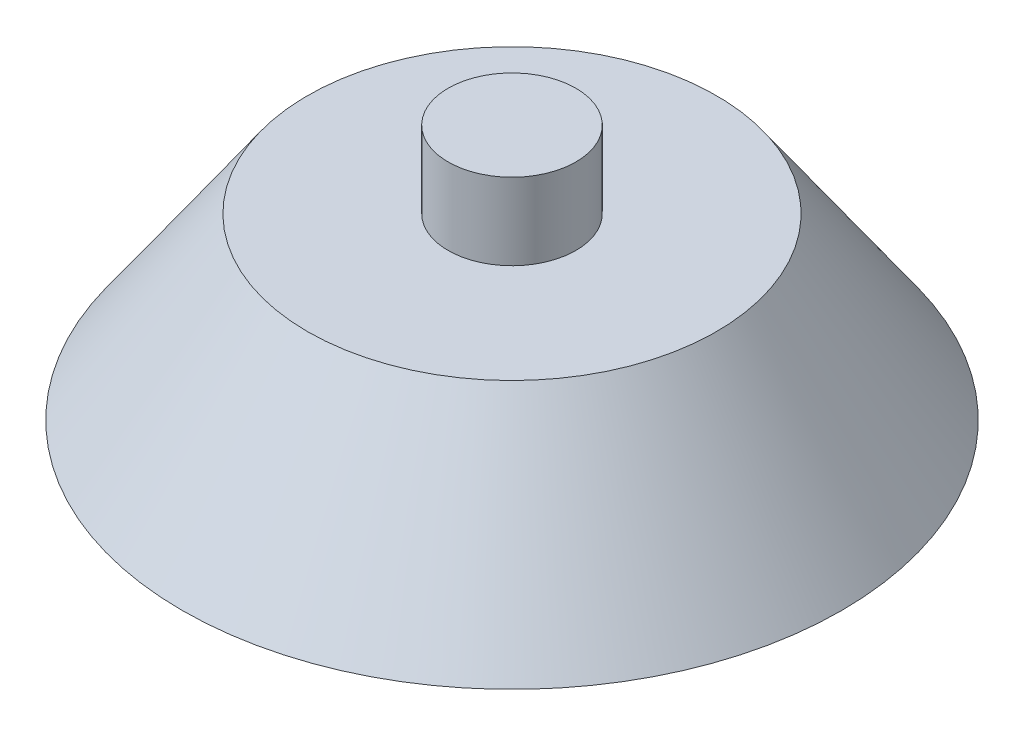
ISO-10303-21;
HEADER;
FILE_DESCRIPTION(('STEP AP214'),'2;1');
FILE_NAME('part.step','',(''),(''),'','','');
FILE_SCHEMA(('AUTOMOTIVE_DESIGN { 1 0 10303 214 1 1 1 1 }'));
ENDSEC;
DATA;
#1=APPLICATION_CONTEXT('core data for automotive mechanical design processes');
#2=APPLICATION_PROTOCOL_DEFINITION('international standard','automotive_design',2000,#1);
#3=PRODUCT_CONTEXT('',#1,'mechanical');
#4=PRODUCT('Part','Part','',(#3));
#5=PRODUCT_RELATED_PRODUCT_CATEGORY('part','',(#4));
#6=PRODUCT_DEFINITION_FORMATION('','',#4);
#7=PRODUCT_DEFINITION_CONTEXT('part definition',#1,'design');
#8=PRODUCT_DEFINITION('design','',#6,#7);
#9=PRODUCT_DEFINITION_SHAPE('','',#8);
#10=(LENGTH_UNIT() NAMED_UNIT(*) SI_UNIT(.MILLI.,.METRE.));
#11=(NAMED_UNIT(*) PLANE_ANGLE_UNIT() SI_UNIT($,.RADIAN.));
#12=(NAMED_UNIT(*) SI_UNIT($,.STERADIAN.) SOLID_ANGLE_UNIT());
#13=UNCERTAINTY_MEASURE_WITH_UNIT(LENGTH_MEASURE(1.E-05),#10,'distance_accuracy_value','');
#14=(GEOMETRIC_REPRESENTATION_CONTEXT(3) GLOBAL_UNCERTAINTY_ASSIGNED_CONTEXT((#13)) GLOBAL_UNIT_ASSIGNED_CONTEXT((#10,
#11,#12)) REPRESENTATION_CONTEXT('',''));
#15=CARTESIAN_POINT('',(0.,0.,0.));
#16=DIRECTION('',(0.,0.,1.));
#17=DIRECTION('',(1.,0.,0.));
#18=AXIS2_PLACEMENT_3D('',#15,#16,#17);
#19=CARTESIAN_POINT('',(0.,100.,0.));
#20=DIRECTION('',(0.,-1.,0.));
#21=DIRECTION('',(0.,0.,-1.));
#22=AXIS2_PLACEMENT_3D('',#19,#20,#21);
#23=CYLINDRICAL_SURFACE('',#22,25.);
#24=CARTESIAN_POINT('',(0.,70.,0.));
#25=DIRECTION('',(0.,1.,0.));
#26=DIRECTION('',(0.,0.,1.));
#27=AXIS2_PLACEMENT_3D('',#24,#25,#26);
#28=CIRCLE('',#27,25.);
#29=CARTESIAN_POINT('',(0.,70.,-25.));
#30=VERTEX_POINT('',#29);
#31=EDGE_CURVE('E53',#30,#30,#28,.T.);
#32=CARTESIAN_POINT('',(0.,100.,0.));
#33=DIRECTION('',(0.,1.,0.));
#34=DIRECTION('',(0.,0.,1.));
#35=AXIS2_PLACEMENT_3D('',#32,#33,#34);
#36=CIRCLE('',#35,25.);
#37=CARTESIAN_POINT('',(0.,100.,-25.));
#38=VERTEX_POINT('',#37);
#39=EDGE_CURVE('E11',#38,#38,#36,.T.);
#40=CARTESIAN_POINT('',(0.,70.,-25.));
#41=CARTESIAN_POINT('',(0.,70.3125,-25.));
#42=CARTESIAN_POINT('',(0.,70.625,-25.));
#43=CARTESIAN_POINT('',(0.,71.25,-25.));
#44=CARTESIAN_POINT('',(0.,71.5625,-25.));
#45=CARTESIAN_POINT('',(0.,72.1875,-25.));
#46=CARTESIAN_POINT('',(0.,72.5,-25.));
#47=CARTESIAN_POINT('',(0.,73.125,-25.));
#48=CARTESIAN_POINT('',(0.,73.4375,-25.));
#49=CARTESIAN_POINT('',(0.,74.0625,-25.));
#50=CARTESIAN_POINT('',(0.,74.375,-25.));
#51=CARTESIAN_POINT('',(0.,75.,-25.));
#52=CARTESIAN_POINT('',(0.,75.3125,-25.));
#53=CARTESIAN_POINT('',(0.,75.9375,-25.));
#54=CARTESIAN_POINT('',(0.,76.25,-25.));
#55=CARTESIAN_POINT('',(0.,76.875,-25.));
#56=CARTESIAN_POINT('',(0.,77.1875,-25.));
#57=CARTESIAN_POINT('',(0.,77.8125,-25.));
#58=CARTESIAN_POINT('',(0.,78.125,-25.));
#59=CARTESIAN_POINT('',(0.,78.75,-25.));
#60=CARTESIAN_POINT('',(0.,79.0625,-25.));
#61=CARTESIAN_POINT('',(0.,79.6875,-25.));
#62=CARTESIAN_POINT('',(0.,80.,-25.));
#63=CARTESIAN_POINT('',(0.,80.625,-25.));
#64=CARTESIAN_POINT('',(0.,80.9375,-25.));
#65=CARTESIAN_POINT('',(0.,81.5625,-25.));
#66=CARTESIAN_POINT('',(0.,81.875,-25.));
#67=CARTESIAN_POINT('',(0.,82.5,-25.));
#68=CARTESIAN_POINT('',(0.,82.8125,-25.));
#69=CARTESIAN_POINT('',(0.,83.4375,-25.));
#70=CARTESIAN_POINT('',(0.,83.75,-25.));
#71=CARTESIAN_POINT('',(0.,84.375,-25.));
#72=CARTESIAN_POINT('',(0.,84.6875,-25.));
#73=CARTESIAN_POINT('',(0.,85.3125,-25.));
#74=CARTESIAN_POINT('',(0.,85.625,-25.));
#75=CARTESIAN_POINT('',(0.,86.25,-25.));
#76=CARTESIAN_POINT('',(0.,86.5625,-25.));
#77=CARTESIAN_POINT('',(0.,87.1875,-25.));
#78=CARTESIAN_POINT('',(0.,87.5,-25.));
#79=CARTESIAN_POINT('',(0.,88.125,-25.));
#80=CARTESIAN_POINT('',(0.,88.4375,-25.));
#81=CARTESIAN_POINT('',(0.,89.0625,-25.));
#82=CARTESIAN_POINT('',(0.,89.375,-25.));
#83=CARTESIAN_POINT('',(0.,90.,-25.));
#84=CARTESIAN_POINT('',(0.,90.3125,-25.));
#85=CARTESIAN_POINT('',(0.,90.9375,-25.));
#86=CARTESIAN_POINT('',(0.,91.25,-25.));
#87=CARTESIAN_POINT('',(0.,91.875,-25.));
#88=CARTESIAN_POINT('',(0.,92.1875,-25.));
#89=CARTESIAN_POINT('',(0.,92.8125,-25.));
#90=CARTESIAN_POINT('',(0.,93.125,-25.));
#91=CARTESIAN_POINT('',(0.,93.75,-25.));
#92=CARTESIAN_POINT('',(0.,94.0625,-25.));
#93=CARTESIAN_POINT('',(0.,94.6875,-25.));
#94=CARTESIAN_POINT('',(0.,95.,-25.));
#95=CARTESIAN_POINT('',(0.,95.625,-25.));
#96=CARTESIAN_POINT('',(0.,95.9375,-25.));
#97=CARTESIAN_POINT('',(0.,96.5625,-25.));
#98=CARTESIAN_POINT('',(0.,96.875,-25.));
#99=CARTESIAN_POINT('',(0.,97.5,-25.));
#100=CARTESIAN_POINT('',(0.,97.8125,-25.));
#101=CARTESIAN_POINT('',(0.,98.4375,-25.));
#102=CARTESIAN_POINT('',(0.,98.75,-25.));
#103=CARTESIAN_POINT('',(0.,99.375,-25.));
#104=CARTESIAN_POINT('',(0.,99.6875,-25.));
#105=CARTESIAN_POINT('',(0.,100.,-25.));
#106=B_SPLINE_CURVE_WITH_KNOTS('',3,(#40,#41,#42,#43,#44,#45,#46,#47,#48,#49,#50,#51,#52,#53,
#54,#55,#56,#57,#58,#59,#60,#61,#62,#63,#64,#65,#66,#67,#68,#69,#70,#71,#72,#73,#74,#75,#76,#77,
#78,#79,#80,#81,#82,#83,#84,#85,#86,#87,#88,#89,#90,#91,#92,#93,#94,#95,#96,#97,#98,#99,#100,
#101,#102,#103,#104,#105),.UNSPECIFIED.,.F.,.F.,(4,2,2,2,2,2,2,2,2,2,2,2,2,2,2,2,2,2,2,2,2,2,2,
2,2,2,2,2,2,2,2,2,4),(0.,0.937500000000008,1.875,2.81250000000001,3.75,4.6875,5.62500000000001,
6.5625,7.50000000000001,8.4375,9.37500000000001,10.3125,11.25,12.1875,13.125,14.0625,15.,
15.9375,16.875,17.8125,18.75,19.6875,20.625,21.5625,22.5,23.4375,24.375,25.3125,26.25,27.1875,
28.125,29.0625,30.),.UNSPECIFIED.);
#107=EDGE_CURVE('BSEAM43',#30,#38,#106,.T.);
#108=ORIENTED_EDGE('',*,*,#31,.T.);
#109=ORIENTED_EDGE('',*,*,#39,.F.);
#110=ORIENTED_EDGE('',*,*,#107,.T.);
#111=ORIENTED_EDGE('',*,*,#107,.F.);
#112=EDGE_LOOP('',(#108,#110,#109,#111));
#113=FACE_BOUND('',#112,.T.);
#114=ADVANCED_FACE('F43',(#113),#23,.T.);
#115=CARTESIAN_POINT('',(0.,100.,0.));
#116=DIRECTION('',(0.,1.,0.));
#117=DIRECTION('',(0.,0.,1.));
#118=AXIS2_PLACEMENT_3D('',#115,#116,#117);
#119=PLANE('',#118);
#120=ORIENTED_EDGE('',*,*,#39,.T.);
#121=EDGE_LOOP('',(#120));
#122=FACE_BOUND('',#121,.T.);
#123=ADVANCED_FACE('F154',(#122),#119,.T.);
#124=CARTESIAN_POINT('',(0.,70.,0.));
#125=DIRECTION('',(0.,-1.,0.));
#126=DIRECTION('',(0.,0.,1.));
#127=AXIS2_PLACEMENT_3D('',#124,#125,#126);
#128=CONICAL_SURFACE('',#127,80.,0.610865238198017);
#129=CARTESIAN_POINT('',(0.,70.,0.));
#130=DIRECTION('',(0.,1.,0.));
#131=DIRECTION('',(0.,0.,1.));
#132=AXIS2_PLACEMENT_3D('',#129,#130,#131);
#133=CIRCLE('',#132,80.);
#134=CARTESIAN_POINT('',(0.,70.,80.));
#135=VERTEX_POINT('',#134);
#136=EDGE_CURVE('E136',#135,#135,#133,.T.);
#137=ORIENTED_EDGE('',*,*,#136,.F.);
#138=EDGE_LOOP('',(#137));
#139=FACE_BOUND('',#138,.T.);
#140=CARTESIAN_POINT('',(0.,0.,0.));
#141=DIRECTION('',(0.,1.,0.));
#142=DIRECTION('',(0.,0.,1.));
#143=AXIS2_PLACEMENT_3D('',#140,#141,#142);
#144=CIRCLE('',#143,129.01452767468);
#145=CARTESIAN_POINT('',(0.,0.,129.01452767468));
#146=VERTEX_POINT('',#145);
#147=EDGE_CURVE('E47',#146,#146,#144,.T.);
#148=ORIENTED_EDGE('',*,*,#147,.T.);
#149=EDGE_LOOP('',(#148));
#150=FACE_BOUND('',#149,.T.);
#151=ADVANCED_FACE('F45',(#139,#150),#128,.T.);
#152=CARTESIAN_POINT('',(0.,70.,0.));
#153=DIRECTION('',(0.,1.,0.));
#154=DIRECTION('',(0.,0.,1.));
#155=AXIS2_PLACEMENT_3D('',#152,#153,#154);
#156=PLANE('',#155);
#157=ORIENTED_EDGE('',*,*,#31,.F.);
#158=EDGE_LOOP('',(#157));
#159=FACE_BOUND('',#158,.T.);
#160=ORIENTED_EDGE('',*,*,#136,.T.);
#161=EDGE_LOOP('',(#160));
#162=FACE_BOUND('',#161,.T.);
#163=ADVANCED_FACE('F145',(#159,#162),#156,.T.);
#164=CARTESIAN_POINT('',(0.,0.,0.));
#165=DIRECTION('',(0.,1.,0.));
#166=DIRECTION('',(0.,0.,1.));
#167=AXIS2_PLACEMENT_3D('',#164,#165,#166);
#168=PLANE('',#167);
#169=DIRECTION('',(1.,0.,0.));
#170=VECTOR('',#169,1.);
#171=CARTESIAN_POINT('',(25.,0.,-25.));
#172=LINE('',#171,#170);
#173=CARTESIAN_POINT('',(-25.,0.,-25.));
#174=VERTEX_POINT('',#173);
#175=CARTESIAN_POINT('',(25.,0.,-25.));
#176=VERTEX_POINT('',#175);
#177=EDGE_CURVE('E96',#174,#176,#172,.T.);
#178=ORIENTED_EDGE('',*,*,#177,.F.);
#179=DIRECTION('',(0.,0.,-1.));
#180=VECTOR('',#179,1.);
#181=CARTESIAN_POINT('',(-25.,0.,25.));
#182=LINE('',#181,#180);
#183=CARTESIAN_POINT('',(-25.,0.,25.));
#184=VERTEX_POINT('',#183);
#185=EDGE_CURVE('E61',#184,#174,#182,.T.);
#186=ORIENTED_EDGE('',*,*,#185,.F.);
#187=DIRECTION('',(-1.,0.,0.));
#188=VECTOR('',#187,1.);
#189=CARTESIAN_POINT('',(25.,0.,25.));
#190=LINE('',#189,#188);
#191=CARTESIAN_POINT('',(25.,0.,25.));
#192=VERTEX_POINT('',#191);
#193=EDGE_CURVE('E116',#192,#184,#190,.T.);
#194=ORIENTED_EDGE('',*,*,#193,.F.);
#195=DIRECTION('',(0.,0.,1.));
#196=VECTOR('',#195,1.);
#197=CARTESIAN_POINT('',(25.,0.,25.));
#198=LINE('',#197,#196);
#199=EDGE_CURVE('E125',#176,#192,#198,.T.);
#200=ORIENTED_EDGE('',*,*,#199,.F.);
#201=EDGE_LOOP('',(#178,#186,#194,#200));
#202=FACE_BOUND('',#201,.T.);
#203=ORIENTED_EDGE('',*,*,#147,.F.);
#204=EDGE_LOOP('',(#203));
#205=FACE_BOUND('',#204,.T.);
#206=ADVANCED_FACE('F148',(#202,#205),#168,.F.);
#207=CARTESIAN_POINT('',(-25.,50.,25.));
#208=DIRECTION('',(-1.,0.,0.));
#209=DIRECTION('',(0.,0.,1.));
#210=AXIS2_PLACEMENT_3D('',#207,#208,#209);
#211=PLANE('',#210);
#212=ORIENTED_EDGE('',*,*,#185,.T.);
#213=DIRECTION('',(0.,-1.,0.));
#214=VECTOR('',#213,1.);
#215=CARTESIAN_POINT('',(-25.,50.,-25.));
#216=LINE('',#215,#214);
#217=CARTESIAN_POINT('',(-25.,50.,-25.));
#218=VERTEX_POINT('',#217);
#219=EDGE_CURVE('E84',#218,#174,#216,.T.);
#220=ORIENTED_EDGE('',*,*,#219,.F.);
#221=DIRECTION('',(0.,0.,-1.));
#222=VECTOR('',#221,1.);
#223=CARTESIAN_POINT('',(-25.,50.,25.));
#224=LINE('',#223,#222);
#225=CARTESIAN_POINT('',(-25.,50.,25.));
#226=VERTEX_POINT('',#225);
#227=EDGE_CURVE('E112',#226,#218,#224,.T.);
#228=ORIENTED_EDGE('',*,*,#227,.F.);
#229=DIRECTION('',(0.,-1.,0.));
#230=VECTOR('',#229,1.);
#231=CARTESIAN_POINT('',(-25.,50.,25.));
#232=LINE('',#231,#230);
#233=EDGE_CURVE('E69',#226,#184,#232,.T.);
#234=ORIENTED_EDGE('',*,*,#233,.T.);
#235=EDGE_LOOP('',(#212,#220,#228,#234));
#236=FACE_BOUND('',#235,.T.);
#237=ADVANCED_FACE('F160',(#236),#211,.F.);
#238=CARTESIAN_POINT('',(25.,50.,25.));
#239=DIRECTION('',(0.,0.,1.));
#240=DIRECTION('',(1.,0.,0.));
#241=AXIS2_PLACEMENT_3D('',#238,#239,#240);
#242=PLANE('',#241);
#243=ORIENTED_EDGE('',*,*,#193,.T.);
#244=ORIENTED_EDGE('',*,*,#233,.F.);
#245=DIRECTION('',(-1.,0.,0.));
#246=VECTOR('',#245,1.);
#247=CARTESIAN_POINT('',(25.,50.,25.));
#248=LINE('',#247,#246);
#249=CARTESIAN_POINT('',(25.,50.,25.));
#250=VERTEX_POINT('',#249);
#251=EDGE_CURVE('E109',#250,#226,#248,.T.);
#252=ORIENTED_EDGE('',*,*,#251,.F.);
#253=DIRECTION('',(0.,-1.,0.));
#254=VECTOR('',#253,1.);
#255=CARTESIAN_POINT('',(25.,50.,25.));
#256=LINE('',#255,#254);
#257=EDGE_CURVE('E101',#250,#192,#256,.T.);
#258=ORIENTED_EDGE('',*,*,#257,.T.);
#259=EDGE_LOOP('',(#243,#244,#252,#258));
#260=FACE_BOUND('',#259,.T.);
#261=ADVANCED_FACE('F166',(#260),#242,.F.);
#262=CARTESIAN_POINT('',(25.,50.,25.));
#263=DIRECTION('',(1.,0.,0.));
#264=DIRECTION('',(0.,0.,-1.));
#265=AXIS2_PLACEMENT_3D('',#262,#263,#264);
#266=PLANE('',#265);
#267=ORIENTED_EDGE('',*,*,#199,.T.);
#268=ORIENTED_EDGE('',*,*,#257,.F.);
#269=DIRECTION('',(0.,0.,1.));
#270=VECTOR('',#269,1.);
#271=CARTESIAN_POINT('',(25.,50.,25.));
#272=LINE('',#271,#270);
#273=CARTESIAN_POINT('',(25.,50.,-25.));
#274=VERTEX_POINT('',#273);
#275=EDGE_CURVE('E104',#274,#250,#272,.T.);
#276=ORIENTED_EDGE('',*,*,#275,.F.);
#277=DIRECTION('',(0.,-1.,0.));
#278=VECTOR('',#277,1.);
#279=CARTESIAN_POINT('',(25.,50.,-25.));
#280=LINE('',#279,#278);
#281=EDGE_CURVE('E89',#274,#176,#280,.T.);
#282=ORIENTED_EDGE('',*,*,#281,.T.);
#283=EDGE_LOOP('',(#267,#268,#276,#282));
#284=FACE_BOUND('',#283,.T.);
#285=ADVANCED_FACE('F105',(#284),#266,.F.);
#286=CARTESIAN_POINT('',(25.,50.,-25.));
#287=DIRECTION('',(0.,0.,-1.));
#288=DIRECTION('',(-1.,0.,0.));
#289=AXIS2_PLACEMENT_3D('',#286,#287,#288);
#290=PLANE('',#289);
#291=ORIENTED_EDGE('',*,*,#177,.T.);
#292=ORIENTED_EDGE('',*,*,#281,.F.);
#293=DIRECTION('',(1.,0.,0.));
#294=VECTOR('',#293,1.);
#295=CARTESIAN_POINT('',(25.,50.,-25.));
#296=LINE('',#295,#294);
#297=EDGE_CURVE('E93',#218,#274,#296,.T.);
#298=ORIENTED_EDGE('',*,*,#297,.F.);
#299=ORIENTED_EDGE('',*,*,#219,.T.);
#300=EDGE_LOOP('',(#291,#292,#298,#299));
#301=FACE_BOUND('',#300,.T.);
#302=ADVANCED_FACE('F91',(#301),#290,.F.);
#303=CARTESIAN_POINT('',(0.,50.,0.));
#304=DIRECTION('',(0.,1.,0.));
#305=DIRECTION('',(0.,0.,1.));
#306=AXIS2_PLACEMENT_3D('',#303,#304,#305);
#307=PLANE('',#306);
#308=ORIENTED_EDGE('',*,*,#227,.T.);
#309=ORIENTED_EDGE('',*,*,#297,.T.);
#310=ORIENTED_EDGE('',*,*,#275,.T.);
#311=ORIENTED_EDGE('',*,*,#251,.T.);
#312=EDGE_LOOP('',(#308,#309,#310,#311));
#313=FACE_BOUND('',#312,.T.);
#314=ADVANCED_FACE('F111',(#313),#307,.F.);
#315=CLOSED_SHELL('',(#114,#123,#151,#163,#206,#237,#261,#285,#302,#314));
#316=MANIFOLD_SOLID_BREP('B2',#315);
#317=ADVANCED_BREP_SHAPE_REPRESENTATION('',(#18,#316),#14);
#318=SHAPE_DEFINITION_REPRESENTATION(#9,#317);
ENDSEC;
END-ISO-10303-21;
